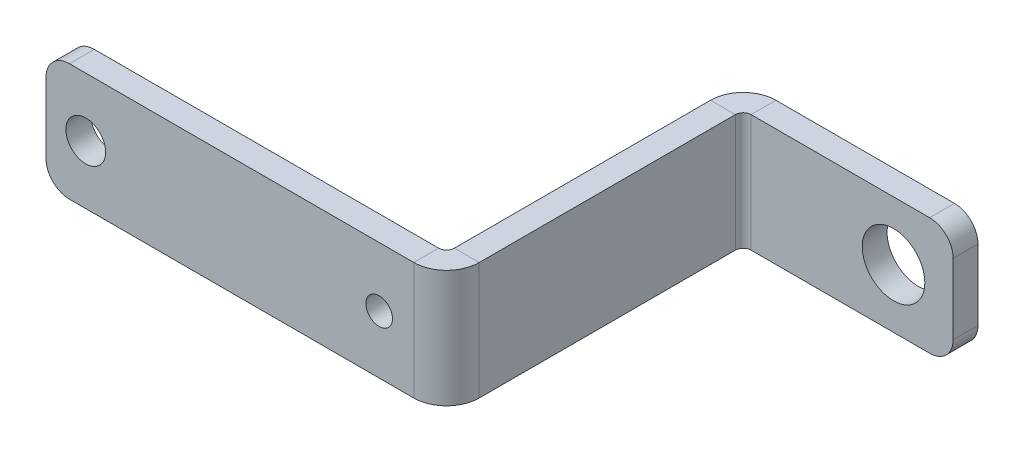
ISO-10303-21;
HEADER;
FILE_DESCRIPTION(('STEP AP214'),'2;1');
FILE_NAME('part.step','',(''),(''),'','','');
FILE_SCHEMA(('AUTOMOTIVE_DESIGN { 1 0 10303 214 1 1 1 1 }'));
ENDSEC;
DATA;
#1=APPLICATION_CONTEXT('core data for automotive mechanical design processes');
#2=APPLICATION_PROTOCOL_DEFINITION('international standard','automotive_design',2000,#1);
#3=PRODUCT_CONTEXT('',#1,'mechanical');
#4=PRODUCT('Part','Part','',(#3));
#5=PRODUCT_RELATED_PRODUCT_CATEGORY('part','',(#4));
#6=PRODUCT_DEFINITION_FORMATION('','',#4);
#7=PRODUCT_DEFINITION_CONTEXT('part definition',#1,'design');
#8=PRODUCT_DEFINITION('design','',#6,#7);
#9=PRODUCT_DEFINITION_SHAPE('','',#8);
#10=(LENGTH_UNIT() NAMED_UNIT(*) SI_UNIT(.MILLI.,.METRE.));
#11=(NAMED_UNIT(*) PLANE_ANGLE_UNIT() SI_UNIT($,.RADIAN.));
#12=(NAMED_UNIT(*) SI_UNIT($,.STERADIAN.) SOLID_ANGLE_UNIT());
#13=UNCERTAINTY_MEASURE_WITH_UNIT(LENGTH_MEASURE(1.E-05),#10,'distance_accuracy_value','');
#14=(GEOMETRIC_REPRESENTATION_CONTEXT(3) GLOBAL_UNCERTAINTY_ASSIGNED_CONTEXT((#13)) GLOBAL_UNIT_ASSIGNED_CONTEXT((#10,
#11,#12)) REPRESENTATION_CONTEXT('',''));
#15=CARTESIAN_POINT('',(0.,0.,0.));
#16=DIRECTION('',(0.,0.,1.));
#17=DIRECTION('',(1.,0.,0.));
#18=AXIS2_PLACEMENT_3D('',#15,#16,#17);
#19=CARTESIAN_POINT('',(126.00428458486,321.12805474167,-1943.33343430082));
#20=DIRECTION('',(0.,1.,0.));
#21=DIRECTION('',(0.,0.,1.));
#22=AXIS2_PLACEMENT_3D('',#19,#20,#21);
#23=PLANE('',#22);
#24=DIRECTION('',(0.,0.,-1.));
#25=VECTOR('',#24,1.);
#26=CARTESIAN_POINT('',(126.00428458486,321.12805474167,-1943.33343430082));
#27=LINE('',#26,#25);
#28=CARTESIAN_POINT('',(126.00428458486,321.12805474167,-1944.33343430082));
#29=VERTEX_POINT('',#28);
#30=CARTESIAN_POINT('',(126.004284584861,321.12805474167,-1977.07093430082));
#31=VERTEX_POINT('',#30);
#32=EDGE_CURVE('E235',#29,#31,#27,.T.);
#33=ORIENTED_EDGE('',*,*,#32,.T.);
#34=DIRECTION('',(-1.,0.,0.));
#35=VECTOR('',#34,1.);
#36=CARTESIAN_POINT('',(126.004284584861,321.12805474167,-1977.07093430082));
#37=LINE('',#36,#35);
#38=CARTESIAN_POINT('',(122.829284584861,321.12805474167,-1977.07093430082));
#39=VERTEX_POINT('',#38);
#40=EDGE_CURVE('E212',#31,#39,#37,.T.);
#41=ORIENTED_EDGE('',*,*,#40,.T.);
#42=DIRECTION('',(0.,0.,-1.));
#43=VECTOR('',#42,1.);
#44=CARTESIAN_POINT('',(122.82928458486,321.12805474167,-1943.33343430082));
#45=LINE('',#44,#43);
#46=CARTESIAN_POINT('',(122.82928458486,321.12805474167,-1944.33343430082));
#47=VERTEX_POINT('',#46);
#48=EDGE_CURVE('E234',#47,#39,#45,.T.);
#49=ORIENTED_EDGE('',*,*,#48,.F.);
#50=DIRECTION('',(1.,0.,0.));
#51=VECTOR('',#50,1.);
#52=CARTESIAN_POINT('',(122.82928458486,321.12805474167,-1944.33343430082));
#53=LINE('',#52,#51);
#54=EDGE_CURVE('E222',#47,#29,#53,.T.);
#55=ORIENTED_EDGE('',*,*,#54,.T.);
#56=EDGE_LOOP('',(#33,#41,#49,#55));
#57=FACE_BOUND('',#56,.T.);
#58=ADVANCED_FACE('F43',(#57),#23,.T.);
#59=CARTESIAN_POINT('',(126.004284584853,0.,4.52723128169523E-13));
#60=DIRECTION('',(-1.,0.,0.));
#61=DIRECTION('',(0.,0.,1.));
#62=AXIS2_PLACEMENT_3D('',#59,#60,#61);
#63=PLANE('',#62);
#64=DIRECTION('',(0.,1.,0.));
#65=VECTOR('',#64,1.);
#66=CARTESIAN_POINT('',(126.004284584861,321.12805474167,-1977.07093430082));
#67=LINE('',#66,#65);
#68=CARTESIAN_POINT('',(126.004284584861,306.12805474167,-1977.07093430082));
#69=VERTEX_POINT('',#68);
#70=EDGE_CURVE('E216',#31,#69,#67,.F.);
#71=ORIENTED_EDGE('',*,*,#70,.F.);
#72=ORIENTED_EDGE('',*,*,#32,.F.);
#73=DIRECTION('',(0.,1.,0.));
#74=VECTOR('',#73,1.);
#75=CARTESIAN_POINT('',(126.00428458486,0.,-1944.33343430082));
#76=LINE('',#75,#74);
#77=CARTESIAN_POINT('',(126.00428458486,306.12805474167,-1944.33343430082));
#78=VERTEX_POINT('',#77);
#79=EDGE_CURVE('E230',#78,#29,#76,.T.);
#80=ORIENTED_EDGE('',*,*,#79,.F.);
#81=DIRECTION('',(0.,0.,1.));
#82=VECTOR('',#81,1.);
#83=CARTESIAN_POINT('',(126.00428458486,306.12805474167,-1978.07093430082));
#84=LINE('',#83,#82);
#85=EDGE_CURVE('E238',#69,#78,#84,.T.);
#86=ORIENTED_EDGE('',*,*,#85,.F.);
#87=EDGE_LOOP('',(#71,#72,#80,#86));
#88=FACE_BOUND('',#87,.T.);
#89=ADVANCED_FACE('F349',(#88),#63,.F.);
#90=CARTESIAN_POINT('',(122.829284584853,0.,4.41637674918696E-13));
#91=DIRECTION('',(-1.,0.,0.));
#92=DIRECTION('',(0.,0.,1.));
#93=AXIS2_PLACEMENT_3D('',#90,#91,#92);
#94=PLANE('',#93);
#95=ORIENTED_EDGE('',*,*,#48,.T.);
#96=DIRECTION('',(0.,1.,0.));
#97=VECTOR('',#96,1.);
#98=CARTESIAN_POINT('',(122.829284584861,321.12805474167,-1977.07093430082));
#99=LINE('',#98,#97);
#100=CARTESIAN_POINT('',(122.82928458486,306.12805474167,-1977.07093430082));
#101=VERTEX_POINT('',#100);
#102=EDGE_CURVE('E180',#39,#101,#99,.F.);
#103=ORIENTED_EDGE('',*,*,#102,.T.);
#104=DIRECTION('',(0.,0.,1.));
#105=VECTOR('',#104,1.);
#106=CARTESIAN_POINT('',(122.82928458486,306.12805474167,-1978.07093430082));
#107=LINE('',#106,#105);
#108=CARTESIAN_POINT('',(122.82928458486,306.12805474167,-1944.33343430082));
#109=VERTEX_POINT('',#108);
#110=EDGE_CURVE('E239',#101,#109,#107,.T.);
#111=ORIENTED_EDGE('',*,*,#110,.T.);
#112=DIRECTION('',(0.,-1.,0.));
#113=VECTOR('',#112,1.);
#114=CARTESIAN_POINT('',(122.82928458486,321.12805474167,-1944.33343430082));
#115=LINE('',#114,#113);
#116=EDGE_CURVE('E224',#47,#109,#115,.T.);
#117=ORIENTED_EDGE('',*,*,#116,.F.);
#118=EDGE_LOOP('',(#95,#103,#111,#117));
#119=FACE_BOUND('',#118,.T.);
#120=ADVANCED_FACE('F356',(#119),#94,.T.);
#121=CARTESIAN_POINT('',(74.8292845848603,321.12805474167,-1940.15843430082));
#122=DIRECTION('',(0.,-1.,0.));
#123=DIRECTION('',(0.,0.,-1.));
#124=AXIS2_PLACEMENT_3D('',#121,#122,#123);
#125=PLANE('',#124);
#126=DIRECTION('',(-1.,0.,0.));
#127=VECTOR('',#126,1.);
#128=CARTESIAN_POINT('',(74.8292845848603,321.12805474167,-1943.33343430082));
#129=LINE('',#128,#127);
#130=CARTESIAN_POINT('',(121.82928458486,321.12805474167,-1943.33343430082));
#131=VERTEX_POINT('',#130);
#132=CARTESIAN_POINT('',(77.8292845848603,321.12805474167,-1943.33343430082));
#133=VERTEX_POINT('',#132);
#134=EDGE_CURVE('E265',#131,#133,#129,.T.);
#135=ORIENTED_EDGE('',*,*,#134,.T.);
#136=DIRECTION('',(0.,0.,-1.));
#137=VECTOR('',#136,1.);
#138=CARTESIAN_POINT('',(77.8292845848603,321.12805474167,-1940.15843430082));
#139=LINE('',#138,#137);
#140=CARTESIAN_POINT('',(77.8292845848603,321.12805474167,-1940.15843430082));
#141=VERTEX_POINT('',#140);
#142=EDGE_CURVE('E11',#133,#141,#139,.F.);
#143=ORIENTED_EDGE('',*,*,#142,.T.);
#144=DIRECTION('',(-1.,0.,0.));
#145=VECTOR('',#144,1.);
#146=CARTESIAN_POINT('',(74.8292845848603,321.12805474167,-1940.15843430082));
#147=LINE('',#146,#145);
#148=CARTESIAN_POINT('',(121.82928458486,321.12805474167,-1940.15843430082));
#149=VERTEX_POINT('',#148);
#150=EDGE_CURVE('E268',#149,#141,#147,.T.);
#151=ORIENTED_EDGE('',*,*,#150,.F.);
#152=DIRECTION('',(0.,0.,1.));
#153=VECTOR('',#152,1.);
#154=CARTESIAN_POINT('',(121.82928458486,321.12805474167,-1943.33343430082));
#155=LINE('',#154,#153);
#156=EDGE_CURVE('E262',#131,#149,#155,.T.);
#157=ORIENTED_EDGE('',*,*,#156,.F.);
#158=EDGE_LOOP('',(#135,#143,#151,#157));
#159=FACE_BOUND('',#158,.T.);
#160=ADVANCED_FACE('F331',(#159),#125,.F.);
#161=CARTESIAN_POINT('',(74.8292845848603,306.12805474167,-1940.15843430082));
#162=DIRECTION('',(0.,1.,0.));
#163=DIRECTION('',(0.,0.,1.));
#164=AXIS2_PLACEMENT_3D('',#161,#162,#163);
#165=PLANE('',#164);
#166=DIRECTION('',(1.,0.,0.));
#167=VECTOR('',#166,1.);
#168=CARTESIAN_POINT('',(74.8292845848603,306.12805474167,-1940.15843430082));
#169=LINE('',#168,#167);
#170=CARTESIAN_POINT('',(77.8292845848603,306.12805474167,-1940.15843430082));
#171=VERTEX_POINT('',#170);
#172=CARTESIAN_POINT('',(121.82928458486,306.12805474167,-1940.15843430082));
#173=VERTEX_POINT('',#172);
#174=EDGE_CURVE('E273',#171,#173,#169,.T.);
#175=ORIENTED_EDGE('',*,*,#174,.F.);
#176=DIRECTION('',(0.,0.,-1.));
#177=VECTOR('',#176,1.);
#178=CARTESIAN_POINT('',(77.8292845848603,306.12805474167,-1940.15843430082));
#179=LINE('',#178,#177);
#180=CARTESIAN_POINT('',(77.8292845848603,306.12805474167,-1943.33343430082));
#181=VERTEX_POINT('',#180);
#182=EDGE_CURVE('E296',#171,#181,#179,.T.);
#183=ORIENTED_EDGE('',*,*,#182,.T.);
#184=DIRECTION('',(1.,0.,0.));
#185=VECTOR('',#184,1.);
#186=CARTESIAN_POINT('',(74.8292845848603,306.12805474167,-1943.33343430082));
#187=LINE('',#186,#185);
#188=CARTESIAN_POINT('',(121.82928458486,306.12805474167,-1943.33343430082));
#189=VERTEX_POINT('',#188);
#190=EDGE_CURVE('E271',#181,#189,#187,.T.);
#191=ORIENTED_EDGE('',*,*,#190,.T.);
#192=DIRECTION('',(0.,0.,1.));
#193=VECTOR('',#192,1.);
#194=CARTESIAN_POINT('',(121.82928458486,306.12805474167,-1943.33343430082));
#195=LINE('',#194,#193);
#196=EDGE_CURVE('E252',#189,#173,#195,.T.);
#197=ORIENTED_EDGE('',*,*,#196,.T.);
#198=EDGE_LOOP('',(#175,#183,#191,#197));
#199=FACE_BOUND('',#198,.T.);
#200=ADVANCED_FACE('F317',(#199),#165,.F.);
#201=CARTESIAN_POINT('',(0.,0.,-1940.15843430082));
#202=DIRECTION('',(0.,0.,1.));
#203=DIRECTION('',(1.,0.,0.));
#204=AXIS2_PLACEMENT_3D('',#201,#202,#203);
#205=PLANE('',#204);
#206=CARTESIAN_POINT('',(117.404284584858,313.537425755326,-1940.15843430082));
#207=DIRECTION('',(0.,0.,1.));
#208=DIRECTION('',(1.,0.,0.));
#209=AXIS2_PLACEMENT_3D('',#206,#207,#208);
#210=CIRCLE('',#209,1.69999999999999);
#211=CARTESIAN_POINT('',(119.104284584858,313.537425755326,-1940.15843430082));
#212=VERTEX_POINT('',#211);
#213=EDGE_CURVE('E462',#212,#212,#210,.T.);
#214=ORIENTED_EDGE('',*,*,#213,.F.);
#215=EDGE_LOOP('',(#214));
#216=FACE_BOUND('',#215,.T.);
#217=CARTESIAN_POINT('',(79.9092845848603,313.62805474167,-1940.15843430082));
#218=DIRECTION('',(0.,0.,1.));
#219=DIRECTION('',(1.,0.,0.));
#220=AXIS2_PLACEMENT_3D('',#217,#218,#219);
#221=CIRCLE('',#220,2.54);
#222=CARTESIAN_POINT('',(82.4492845848603,313.62805474167,-1940.15843430082));
#223=VERTEX_POINT('',#222);
#224=EDGE_CURVE('E474',#223,#223,#221,.T.);
#225=ORIENTED_EDGE('',*,*,#224,.F.);
#226=EDGE_LOOP('',(#225));
#227=FACE_BOUND('',#226,.T.);
#228=DIRECTION('',(0.,-1.,0.));
#229=VECTOR('',#228,1.);
#230=CARTESIAN_POINT('',(74.8292845848603,321.12805474167,-1940.15843430082));
#231=LINE('',#230,#229);
#232=CARTESIAN_POINT('',(74.8292845848603,318.12805474167,-1940.15843430082));
#233=VERTEX_POINT('',#232);
#234=CARTESIAN_POINT('',(74.8292845848603,309.12805474167,-1940.15843430082));
#235=VERTEX_POINT('',#234);
#236=EDGE_CURVE('E270',#233,#235,#231,.T.);
#237=ORIENTED_EDGE('',*,*,#236,.T.);
#238=CARTESIAN_POINT('',(77.8292845848603,309.12805474167,-1940.15843430082));
#239=DIRECTION('',(0.,0.,1.));
#240=DIRECTION('',(1.,0.,0.));
#241=AXIS2_PLACEMENT_3D('',#238,#239,#240);
#242=CIRCLE('',#241,3.);
#243=EDGE_CURVE('E52',#235,#171,#242,.T.);
#244=ORIENTED_EDGE('',*,*,#243,.T.);
#245=ORIENTED_EDGE('',*,*,#174,.T.);
#246=DIRECTION('',(0.,-1.,0.));
#247=VECTOR('',#246,1.);
#248=CARTESIAN_POINT('',(121.82928458486,306.12805474167,-1940.15843430082));
#249=LINE('',#248,#247);
#250=EDGE_CURVE('E245',#173,#149,#249,.F.);
#251=ORIENTED_EDGE('',*,*,#250,.T.);
#252=ORIENTED_EDGE('',*,*,#150,.T.);
#253=CARTESIAN_POINT('',(77.8292845848603,318.12805474167,-1940.15843430082));
#254=DIRECTION('',(0.,0.,1.));
#255=DIRECTION('',(1.,0.,0.));
#256=AXIS2_PLACEMENT_3D('',#253,#254,#255);
#257=CIRCLE('',#256,3.);
#258=EDGE_CURVE('E307',#141,#233,#257,.T.);
#259=ORIENTED_EDGE('',*,*,#258,.T.);
#260=EDGE_LOOP('',(#237,#244,#245,#251,#252,#259));
#261=FACE_BOUND('',#260,.T.);
#262=ADVANCED_FACE('F312',(#216,#227,#261),#205,.T.);
#263=CARTESIAN_POINT('',(0.,0.,-1943.33343430082));
#264=DIRECTION('',(0.,0.,1.));
#265=DIRECTION('',(1.,0.,0.));
#266=AXIS2_PLACEMENT_3D('',#263,#264,#265);
#267=PLANE('',#266);
#268=CARTESIAN_POINT('',(117.404284584858,313.537425755326,-1943.33343430082));
#269=DIRECTION('',(0.,0.,1.));
#270=DIRECTION('',(1.,0.,0.));
#271=AXIS2_PLACEMENT_3D('',#268,#269,#270);
#272=CIRCLE('',#271,1.69999999999999);
#273=CARTESIAN_POINT('',(119.104284584858,313.537425755326,-1943.33343430082));
#274=VERTEX_POINT('',#273);
#275=EDGE_CURVE('E465',#274,#274,#272,.T.);
#276=ORIENTED_EDGE('',*,*,#275,.T.);
#277=EDGE_LOOP('',(#276));
#278=FACE_BOUND('',#277,.T.);
#279=CARTESIAN_POINT('',(79.9092845848603,313.62805474167,-1943.33343430082));
#280=DIRECTION('',(0.,0.,1.));
#281=DIRECTION('',(1.,0.,0.));
#282=AXIS2_PLACEMENT_3D('',#279,#280,#281);
#283=CIRCLE('',#282,2.54);
#284=CARTESIAN_POINT('',(82.4492845848603,313.62805474167,-1943.33343430082));
#285=VERTEX_POINT('',#284);
#286=EDGE_CURVE('E47',#285,#285,#283,.T.);
#287=ORIENTED_EDGE('',*,*,#286,.T.);
#288=EDGE_LOOP('',(#287));
#289=FACE_BOUND('',#288,.T.);
#290=ORIENTED_EDGE('',*,*,#190,.F.);
#291=CARTESIAN_POINT('',(77.8292845848603,309.12805474167,-1943.33343430082));
#292=DIRECTION('',(0.,0.,1.));
#293=DIRECTION('',(1.,0.,0.));
#294=AXIS2_PLACEMENT_3D('',#291,#292,#293);
#295=CIRCLE('',#294,3.);
#296=CARTESIAN_POINT('',(74.8292845848603,309.12805474167,-1943.33343430082));
#297=VERTEX_POINT('',#296);
#298=EDGE_CURVE('E301',#181,#297,#295,.F.);
#299=ORIENTED_EDGE('',*,*,#298,.T.);
#300=DIRECTION('',(0.,-1.,0.));
#301=VECTOR('',#300,1.);
#302=CARTESIAN_POINT('',(74.8292845848603,321.12805474167,-1943.33343430082));
#303=LINE('',#302,#301);
#304=CARTESIAN_POINT('',(74.8292845848603,318.12805474167,-1943.33343430082));
#305=VERTEX_POINT('',#304);
#306=EDGE_CURVE('E277',#305,#297,#303,.T.);
#307=ORIENTED_EDGE('',*,*,#306,.F.);
#308=CARTESIAN_POINT('',(77.8292845848603,318.12805474167,-1943.33343430082));
#309=DIRECTION('',(0.,0.,1.));
#310=DIRECTION('',(1.,0.,0.));
#311=AXIS2_PLACEMENT_3D('',#308,#309,#310);
#312=CIRCLE('',#311,3.);
#313=EDGE_CURVE('E299',#305,#133,#312,.F.);
#314=ORIENTED_EDGE('',*,*,#313,.T.);
#315=ORIENTED_EDGE('',*,*,#134,.F.);
#316=DIRECTION('',(0.,-1.,0.));
#317=VECTOR('',#316,1.);
#318=CARTESIAN_POINT('',(121.82928458486,306.12805474167,-1943.33343430082));
#319=LINE('',#318,#317);
#320=EDGE_CURVE('E258',#189,#131,#319,.F.);
#321=ORIENTED_EDGE('',*,*,#320,.F.);
#322=EDGE_LOOP('',(#290,#299,#307,#314,#315,#321));
#323=FACE_BOUND('',#322,.T.);
#324=ADVANCED_FACE('F323',(#278,#289,#323),#267,.F.);
#325=CARTESIAN_POINT('',(74.8292845848603,321.12805474167,-1940.15843430082));
#326=DIRECTION('',(1.,0.,0.));
#327=DIRECTION('',(0.,0.,-1.));
#328=AXIS2_PLACEMENT_3D('',#325,#326,#327);
#329=PLANE('',#328);
#330=ORIENTED_EDGE('',*,*,#306,.T.);
#331=DIRECTION('',(0.,0.,-1.));
#332=VECTOR('',#331,1.);
#333=CARTESIAN_POINT('',(74.8292845848603,309.12805474167,-1940.15843430082));
#334=LINE('',#333,#332);
#335=EDGE_CURVE('E65',#297,#235,#334,.F.);
#336=ORIENTED_EDGE('',*,*,#335,.T.);
#337=ORIENTED_EDGE('',*,*,#236,.F.);
#338=DIRECTION('',(0.,0.,-1.));
#339=VECTOR('',#338,1.);
#340=CARTESIAN_POINT('',(74.8292845848603,318.12805474167,-1940.15843430082));
#341=LINE('',#340,#339);
#342=EDGE_CURVE('E303',#233,#305,#341,.T.);
#343=ORIENTED_EDGE('',*,*,#342,.T.);
#344=EDGE_LOOP('',(#330,#336,#337,#343));
#345=FACE_BOUND('',#344,.T.);
#346=ADVANCED_FACE('F325',(#345),#329,.F.);
#347=CARTESIAN_POINT('',(121.82928458486,321.12805474167,-1944.33343430082));
#348=DIRECTION('',(0.,1.,0.));
#349=DIRECTION('',(0.,0.,1.));
#350=AXIS2_PLACEMENT_3D('',#347,#348,#349);
#351=PLANE('',#350);
#352=ORIENTED_EDGE('',*,*,#54,.F.);
#353=CARTESIAN_POINT('',(121.82928458486,321.12805474167,-1944.33343430082));
#354=DIRECTION('',(0.,-1.,0.));
#355=DIRECTION('',(0.,0.,-1.));
#356=AXIS2_PLACEMENT_3D('',#353,#354,#355);
#357=CIRCLE('',#356,0.999999999999959);
#358=EDGE_CURVE('E255',#131,#47,#357,.F.);
#359=ORIENTED_EDGE('',*,*,#358,.F.);
#360=ORIENTED_EDGE('',*,*,#156,.T.);
#361=CARTESIAN_POINT('',(121.82928458486,321.12805474167,-1944.33343430082));
#362=DIRECTION('',(0.,-1.,0.));
#363=DIRECTION('',(0.,0.,-1.));
#364=AXIS2_PLACEMENT_3D('',#361,#362,#363);
#365=CIRCLE('',#364,4.17499999999996);
#366=EDGE_CURVE('E248',#149,#29,#365,.F.);
#367=ORIENTED_EDGE('',*,*,#366,.T.);
#368=EDGE_LOOP('',(#352,#359,#360,#367));
#369=FACE_BOUND('',#368,.T.);
#370=ADVANCED_FACE('F334',(#369),#351,.T.);
#371=CARTESIAN_POINT('',(121.82928458486,306.12805474167,-1944.33343430082));
#372=DIRECTION('',(0.,1.,0.));
#373=DIRECTION('',(0.,0.,1.));
#374=AXIS2_PLACEMENT_3D('',#371,#372,#373);
#375=PLANE('',#374);
#376=CARTESIAN_POINT('',(121.82928458486,306.12805474167,-1944.33343430082));
#377=DIRECTION('',(0.,-1.,0.));
#378=DIRECTION('',(0.,0.,-1.));
#379=AXIS2_PLACEMENT_3D('',#376,#377,#378);
#380=CIRCLE('',#379,0.999999999999959);
#381=EDGE_CURVE('E241',#109,#189,#380,.T.);
#382=ORIENTED_EDGE('',*,*,#381,.F.);
#383=DIRECTION('',(1.,0.,0.));
#384=VECTOR('',#383,1.);
#385=CARTESIAN_POINT('',(122.82928458486,306.12805474167,-1944.33343430082));
#386=LINE('',#385,#384);
#387=EDGE_CURVE('E227',#109,#78,#386,.T.);
#388=ORIENTED_EDGE('',*,*,#387,.T.);
#389=CARTESIAN_POINT('',(121.82928458486,306.12805474167,-1944.33343430082));
#390=DIRECTION('',(0.,-1.,0.));
#391=DIRECTION('',(0.,0.,-1.));
#392=AXIS2_PLACEMENT_3D('',#389,#390,#391);
#393=CIRCLE('',#392,4.17499999999996);
#394=EDGE_CURVE('E249',#78,#173,#393,.T.);
#395=ORIENTED_EDGE('',*,*,#394,.T.);
#396=ORIENTED_EDGE('',*,*,#196,.F.);
#397=EDGE_LOOP('',(#382,#388,#395,#396));
#398=FACE_BOUND('',#397,.T.);
#399=ADVANCED_FACE('F340',(#398),#375,.F.);
#400=CARTESIAN_POINT('',(121.82928458486,306.12805474167,-1944.33343430082));
#401=DIRECTION('',(0.,-1.,0.));
#402=DIRECTION('',(1.,0.,0.));
#403=AXIS2_PLACEMENT_3D('',#400,#401,#402);
#404=CYLINDRICAL_SURFACE('',#403,4.17499999999996);
#405=ORIENTED_EDGE('',*,*,#250,.F.);
#406=ORIENTED_EDGE('',*,*,#394,.F.);
#407=ORIENTED_EDGE('',*,*,#79,.T.);
#408=ORIENTED_EDGE('',*,*,#366,.F.);
#409=EDGE_LOOP('',(#405,#406,#407,#408));
#410=FACE_BOUND('',#409,.T.);
#411=ADVANCED_FACE('F337',(#410),#404,.T.);
#412=CARTESIAN_POINT('',(121.82928458486,306.12805474167,-1944.33343430082));
#413=DIRECTION('',(0.,-1.,0.));
#414=DIRECTION('',(1.,0.,0.));
#415=AXIS2_PLACEMENT_3D('',#412,#413,#414);
#416=CYLINDRICAL_SURFACE('',#415,0.999999999999959);
#417=ORIENTED_EDGE('',*,*,#320,.T.);
#418=ORIENTED_EDGE('',*,*,#358,.T.);
#419=ORIENTED_EDGE('',*,*,#116,.T.);
#420=ORIENTED_EDGE('',*,*,#381,.T.);
#421=EDGE_LOOP('',(#417,#418,#419,#420));
#422=FACE_BOUND('',#421,.T.);
#423=ADVANCED_FACE('F354',(#422),#416,.F.);
#424=CARTESIAN_POINT('',(126.00428458486,306.12805474167,-1978.07093430082));
#425=DIRECTION('',(0.,-1.,0.));
#426=DIRECTION('',(0.,0.,-1.));
#427=AXIS2_PLACEMENT_3D('',#424,#425,#426);
#428=PLANE('',#427);
#429=DIRECTION('',(-1.,0.,0.));
#430=VECTOR('',#429,1.);
#431=CARTESIAN_POINT('',(126.004284584861,306.12805474167,-1977.07093430082));
#432=LINE('',#431,#430);
#433=EDGE_CURVE('E219',#69,#101,#432,.T.);
#434=ORIENTED_EDGE('',*,*,#433,.F.);
#435=ORIENTED_EDGE('',*,*,#85,.T.);
#436=ORIENTED_EDGE('',*,*,#387,.F.);
#437=ORIENTED_EDGE('',*,*,#110,.F.);
#438=EDGE_LOOP('',(#434,#435,#436,#437));
#439=FACE_BOUND('',#438,.T.);
#440=ADVANCED_FACE('F358',(#439),#428,.T.);
#441=CARTESIAN_POINT('',(127.00428458486,306.12805474167,-1977.07093430082));
#442=DIRECTION('',(0.,-1.,0.));
#443=DIRECTION('',(0.,0.,-1.));
#444=AXIS2_PLACEMENT_3D('',#441,#442,#443);
#445=PLANE('',#444);
#446=DIRECTION('',(0.,0.,-1.));
#447=VECTOR('',#446,1.);
#448=CARTESIAN_POINT('',(127.00428458486,306.12805474167,-1978.07093430082));
#449=LINE('',#448,#447);
#450=CARTESIAN_POINT('',(127.00428458486,306.12805474167,-1978.07093430082));
#451=VERTEX_POINT('',#450);
#452=CARTESIAN_POINT('',(127.00428458486,306.12805474167,-1981.24593430082));
#453=VERTEX_POINT('',#452);
#454=EDGE_CURVE('E202',#451,#453,#449,.T.);
#455=ORIENTED_EDGE('',*,*,#454,.F.);
#456=CARTESIAN_POINT('',(127.00428458486,306.12805474167,-1977.07093430082));
#457=DIRECTION('',(0.,1.,0.));
#458=DIRECTION('',(0.,0.,1.));
#459=AXIS2_PLACEMENT_3D('',#456,#457,#458);
#460=CIRCLE('',#459,0.99999999999989);
#461=EDGE_CURVE('E183',#69,#451,#460,.F.);
#462=ORIENTED_EDGE('',*,*,#461,.F.);
#463=ORIENTED_EDGE('',*,*,#433,.T.);
#464=CARTESIAN_POINT('',(127.00428458486,306.12805474167,-1977.07093430082));
#465=DIRECTION('',(0.,1.,0.));
#466=DIRECTION('',(0.,0.,1.));
#467=AXIS2_PLACEMENT_3D('',#464,#465,#466);
#468=CIRCLE('',#467,4.17499999999989);
#469=EDGE_CURVE('E211',#101,#453,#468,.F.);
#470=ORIENTED_EDGE('',*,*,#469,.T.);
#471=EDGE_LOOP('',(#455,#462,#463,#470));
#472=FACE_BOUND('',#471,.T.);
#473=ADVANCED_FACE('F361',(#472),#445,.T.);
#474=CARTESIAN_POINT('',(127.00428458486,321.12805474167,-1977.07093430082));
#475=DIRECTION('',(0.,-1.,0.));
#476=DIRECTION('',(0.,0.,-1.));
#477=AXIS2_PLACEMENT_3D('',#474,#475,#476);
#478=PLANE('',#477);
#479=CARTESIAN_POINT('',(127.00428458486,321.12805474167,-1977.07093430082));
#480=DIRECTION('',(0.,1.,0.));
#481=DIRECTION('',(0.,0.,1.));
#482=AXIS2_PLACEMENT_3D('',#479,#480,#481);
#483=CIRCLE('',#482,0.99999999999989);
#484=CARTESIAN_POINT('',(127.00428458486,321.12805474167,-1978.07093430082));
#485=VERTEX_POINT('',#484);
#486=EDGE_CURVE('E170',#485,#31,#483,.T.);
#487=ORIENTED_EDGE('',*,*,#486,.F.);
#488=DIRECTION('',(0.,0.,-1.));
#489=VECTOR('',#488,1.);
#490=CARTESIAN_POINT('',(127.00428458486,321.12805474167,-1978.07093430082));
#491=LINE('',#490,#489);
#492=CARTESIAN_POINT('',(127.00428458486,321.12805474167,-1981.24593430082));
#493=VERTEX_POINT('',#492);
#494=EDGE_CURVE('E164',#485,#493,#491,.T.);
#495=ORIENTED_EDGE('',*,*,#494,.T.);
#496=CARTESIAN_POINT('',(127.00428458486,321.12805474167,-1977.07093430082));
#497=DIRECTION('',(0.,1.,0.));
#498=DIRECTION('',(0.,0.,1.));
#499=AXIS2_PLACEMENT_3D('',#496,#497,#498);
#500=CIRCLE('',#499,4.17499999999989);
#501=EDGE_CURVE('E175',#493,#39,#500,.T.);
#502=ORIENTED_EDGE('',*,*,#501,.T.);
#503=ORIENTED_EDGE('',*,*,#40,.F.);
#504=EDGE_LOOP('',(#487,#495,#502,#503));
#505=FACE_BOUND('',#504,.T.);
#506=ADVANCED_FACE('F186',(#505),#478,.F.);
#507=CARTESIAN_POINT('',(127.00428458486,321.12805474167,-1977.07093430082));
#508=DIRECTION('',(0.,1.,0.));
#509=DIRECTION('',(0.,0.,-1.));
#510=AXIS2_PLACEMENT_3D('',#507,#508,#509);
#511=CYLINDRICAL_SURFACE('',#510,4.17499999999989);
#512=ORIENTED_EDGE('',*,*,#102,.F.);
#513=ORIENTED_EDGE('',*,*,#501,.F.);
#514=DIRECTION('',(0.,-1.,0.));
#515=VECTOR('',#514,1.);
#516=CARTESIAN_POINT('',(127.00428458486,0.,-1981.24593430082));
#517=LINE('',#516,#515);
#518=EDGE_CURVE('E177',#493,#453,#517,.T.);
#519=ORIENTED_EDGE('',*,*,#518,.T.);
#520=ORIENTED_EDGE('',*,*,#469,.F.);
#521=EDGE_LOOP('',(#512,#513,#519,#520));
#522=FACE_BOUND('',#521,.T.);
#523=ADVANCED_FACE('F176',(#522),#511,.T.);
#524=CARTESIAN_POINT('',(127.00428458486,321.12805474167,-1977.07093430082));
#525=DIRECTION('',(0.,1.,0.));
#526=DIRECTION('',(0.,0.,-1.));
#527=AXIS2_PLACEMENT_3D('',#524,#525,#526);
#528=CYLINDRICAL_SURFACE('',#527,0.99999999999989);
#529=ORIENTED_EDGE('',*,*,#70,.T.);
#530=ORIENTED_EDGE('',*,*,#461,.T.);
#531=DIRECTION('',(0.,1.,0.));
#532=VECTOR('',#531,1.);
#533=CARTESIAN_POINT('',(127.00428458486,306.12805474167,-1978.07093430082));
#534=LINE('',#533,#532);
#535=EDGE_CURVE('E188',#451,#485,#534,.T.);
#536=ORIENTED_EDGE('',*,*,#535,.T.);
#537=ORIENTED_EDGE('',*,*,#486,.T.);
#538=EDGE_LOOP('',(#529,#530,#536,#537));
#539=FACE_BOUND('',#538,.T.);
#540=ADVANCED_FACE('F366',(#539),#528,.F.);
#541=CARTESIAN_POINT('',(126.00428458486,306.12805474167,-1981.24593430082));
#542=DIRECTION('',(0.,-1.,0.));
#543=DIRECTION('',(0.,0.,-1.));
#544=AXIS2_PLACEMENT_3D('',#541,#542,#543);
#545=PLANE('',#544);
#546=DIRECTION('',(1.,0.,0.));
#547=VECTOR('',#546,1.);
#548=CARTESIAN_POINT('',(126.00428458486,306.12805474167,-1981.24593430082));
#549=LINE('',#548,#547);
#550=CARTESIAN_POINT('',(149.82928458486,306.12805474167,-1981.24593430082));
#551=VERTEX_POINT('',#550);
#552=EDGE_CURVE('E194',#453,#551,#549,.T.);
#553=ORIENTED_EDGE('',*,*,#552,.T.);
#554=DIRECTION('',(0.,0.,1.));
#555=VECTOR('',#554,1.);
#556=CARTESIAN_POINT('',(149.82928458486,306.12805474167,-1981.24593430082));
#557=LINE('',#556,#555);
#558=CARTESIAN_POINT('',(149.82928458486,306.12805474167,-1978.07093430082));
#559=VERTEX_POINT('',#558);
#560=EDGE_CURVE('E275',#551,#559,#557,.T.);
#561=ORIENTED_EDGE('',*,*,#560,.T.);
#562=DIRECTION('',(1.,0.,0.));
#563=VECTOR('',#562,1.);
#564=CARTESIAN_POINT('',(126.00428458486,306.12805474167,-1978.07093430082));
#565=LINE('',#564,#563);
#566=EDGE_CURVE('E195',#451,#559,#565,.T.);
#567=ORIENTED_EDGE('',*,*,#566,.F.);
#568=ORIENTED_EDGE('',*,*,#454,.T.);
#569=EDGE_LOOP('',(#553,#561,#567,#568));
#570=FACE_BOUND('',#569,.T.);
#571=ADVANCED_FACE('F372',(#570),#545,.T.);
#572=CARTESIAN_POINT('',(152.82928458486,321.12805474167,-1981.24593430082));
#573=DIRECTION('',(0.,1.,0.));
#574=DIRECTION('',(0.,0.,1.));
#575=AXIS2_PLACEMENT_3D('',#572,#573,#574);
#576=PLANE('',#575);
#577=DIRECTION('',(-1.,0.,0.));
#578=VECTOR('',#577,1.);
#579=CARTESIAN_POINT('',(152.82928458486,321.12805474167,-1978.07093430082));
#580=LINE('',#579,#578);
#581=CARTESIAN_POINT('',(149.82928458486,321.12805474167,-1978.07093430082));
#582=VERTEX_POINT('',#581);
#583=EDGE_CURVE('E204',#582,#485,#580,.T.);
#584=ORIENTED_EDGE('',*,*,#583,.F.);
#585=DIRECTION('',(0.,0.,1.));
#586=VECTOR('',#585,1.);
#587=CARTESIAN_POINT('',(149.82928458486,321.12805474167,-1981.24593430082));
#588=LINE('',#587,#586);
#589=CARTESIAN_POINT('',(149.82928458486,321.12805474167,-1981.24593430082));
#590=VERTEX_POINT('',#589);
#591=EDGE_CURVE('E166',#582,#590,#588,.F.);
#592=ORIENTED_EDGE('',*,*,#591,.T.);
#593=DIRECTION('',(-1.,0.,0.));
#594=VECTOR('',#593,1.);
#595=CARTESIAN_POINT('',(152.82928458486,321.12805474167,-1981.24593430082));
#596=LINE('',#595,#594);
#597=EDGE_CURVE('E159',#590,#493,#596,.T.);
#598=ORIENTED_EDGE('',*,*,#597,.T.);
#599=ORIENTED_EDGE('',*,*,#494,.F.);
#600=EDGE_LOOP('',(#584,#592,#598,#599));
#601=FACE_BOUND('',#600,.T.);
#602=ADVANCED_FACE('F162',(#601),#576,.T.);
#603=CARTESIAN_POINT('',(0.,0.,-1981.24593430082));
#604=DIRECTION('',(0.,0.,1.));
#605=DIRECTION('',(1.,0.,0.));
#606=AXIS2_PLACEMENT_3D('',#603,#604,#605);
#607=PLANE('',#606);
#608=CARTESIAN_POINT('',(145.20928458486,313.62805474167,-1981.24593430082));
#609=DIRECTION('',(0.,0.,1.));
#610=DIRECTION('',(1.,0.,0.));
#611=AXIS2_PLACEMENT_3D('',#608,#609,#610);
#612=CIRCLE('',#611,3.99999999999999);
#613=CARTESIAN_POINT('',(149.20928458486,313.62805474167,-1981.24593430082));
#614=VERTEX_POINT('',#613);
#615=EDGE_CURVE('E469',#614,#614,#612,.T.);
#616=ORIENTED_EDGE('',*,*,#615,.T.);
#617=EDGE_LOOP('',(#616));
#618=FACE_BOUND('',#617,.T.);
#619=DIRECTION('',(0.,1.,0.));
#620=VECTOR('',#619,1.);
#621=CARTESIAN_POINT('',(152.82928458486,306.12805474167,-1981.24593430082));
#622=LINE('',#621,#620);
#623=CARTESIAN_POINT('',(152.82928458486,309.12805474167,-1981.24593430082));
#624=VERTEX_POINT('',#623);
#625=CARTESIAN_POINT('',(152.82928458486,318.12805474167,-1981.24593430082));
#626=VERTEX_POINT('',#625);
#627=EDGE_CURVE('E171',#624,#626,#622,.T.);
#628=ORIENTED_EDGE('',*,*,#627,.F.);
#629=CARTESIAN_POINT('',(149.82928458486,309.12805474167,-1981.24593430082));
#630=DIRECTION('',(0.,0.,1.));
#631=DIRECTION('',(1.,0.,0.));
#632=AXIS2_PLACEMENT_3D('',#629,#630,#631);
#633=CIRCLE('',#632,3.);
#634=EDGE_CURVE('E293',#624,#551,#633,.F.);
#635=ORIENTED_EDGE('',*,*,#634,.T.);
#636=ORIENTED_EDGE('',*,*,#552,.F.);
#637=ORIENTED_EDGE('',*,*,#518,.F.);
#638=ORIENTED_EDGE('',*,*,#597,.F.);
#639=CARTESIAN_POINT('',(149.82928458486,318.12805474167,-1981.24593430082));
#640=DIRECTION('',(0.,0.,1.));
#641=DIRECTION('',(1.,0.,0.));
#642=AXIS2_PLACEMENT_3D('',#639,#640,#641);
#643=CIRCLE('',#642,3.);
#644=EDGE_CURVE('E291',#590,#626,#643,.F.);
#645=ORIENTED_EDGE('',*,*,#644,.T.);
#646=EDGE_LOOP('',(#628,#635,#636,#637,#638,#645));
#647=FACE_BOUND('',#646,.T.);
#648=ADVANCED_FACE('F192',(#618,#647),#607,.F.);
#649=CARTESIAN_POINT('',(0.,0.,-1978.07093430082));
#650=DIRECTION('',(0.,0.,1.));
#651=DIRECTION('',(1.,0.,0.));
#652=AXIS2_PLACEMENT_3D('',#649,#650,#651);
#653=PLANE('',#652);
#654=CARTESIAN_POINT('',(145.20928458486,313.62805474167,-1978.07093430082));
#655=DIRECTION('',(0.,0.,1.));
#656=DIRECTION('',(1.,0.,0.));
#657=AXIS2_PLACEMENT_3D('',#654,#655,#656);
#658=CIRCLE('',#657,3.99999999999999);
#659=CARTESIAN_POINT('',(149.20928458486,313.62805474167,-1978.07093430082));
#660=VERTEX_POINT('',#659);
#661=EDGE_CURVE('E466',#660,#660,#658,.T.);
#662=ORIENTED_EDGE('',*,*,#661,.F.);
#663=EDGE_LOOP('',(#662));
#664=FACE_BOUND('',#663,.T.);
#665=ORIENTED_EDGE('',*,*,#566,.T.);
#666=CARTESIAN_POINT('',(149.82928458486,309.12805474167,-1978.07093430082));
#667=DIRECTION('',(0.,0.,1.));
#668=DIRECTION('',(1.,0.,0.));
#669=AXIS2_PLACEMENT_3D('',#666,#667,#668);
#670=CIRCLE('',#669,3.);
#671=CARTESIAN_POINT('',(152.82928458486,309.12805474167,-1978.07093430082));
#672=VERTEX_POINT('',#671);
#673=EDGE_CURVE('E284',#559,#672,#670,.T.);
#674=ORIENTED_EDGE('',*,*,#673,.T.);
#675=DIRECTION('',(0.,1.,0.));
#676=VECTOR('',#675,1.);
#677=CARTESIAN_POINT('',(152.82928458486,306.12805474167,-1978.07093430082));
#678=LINE('',#677,#676);
#679=CARTESIAN_POINT('',(152.82928458486,318.12805474167,-1978.07093430082));
#680=VERTEX_POINT('',#679);
#681=EDGE_CURVE('E198',#672,#680,#678,.T.);
#682=ORIENTED_EDGE('',*,*,#681,.T.);
#683=CARTESIAN_POINT('',(149.82928458486,318.12805474167,-1978.07093430082));
#684=DIRECTION('',(0.,0.,1.));
#685=DIRECTION('',(1.,0.,0.));
#686=AXIS2_PLACEMENT_3D('',#683,#684,#685);
#687=CIRCLE('',#686,3.);
#688=EDGE_CURVE('E282',#680,#582,#687,.T.);
#689=ORIENTED_EDGE('',*,*,#688,.T.);
#690=ORIENTED_EDGE('',*,*,#583,.T.);
#691=ORIENTED_EDGE('',*,*,#535,.F.);
#692=EDGE_LOOP('',(#665,#674,#682,#689,#690,#691));
#693=FACE_BOUND('',#692,.T.);
#694=ADVANCED_FACE('F369',(#664,#693),#653,.T.);
#695=CARTESIAN_POINT('',(152.82928458486,306.12805474167,-1981.24593430082));
#696=DIRECTION('',(1.,0.,0.));
#697=DIRECTION('',(0.,0.,-1.));
#698=AXIS2_PLACEMENT_3D('',#695,#696,#697);
#699=PLANE('',#698);
#700=ORIENTED_EDGE('',*,*,#681,.F.);
#701=DIRECTION('',(0.,0.,1.));
#702=VECTOR('',#701,1.);
#703=CARTESIAN_POINT('',(152.82928458486,309.12805474167,-1981.24593430082));
#704=LINE('',#703,#702);
#705=EDGE_CURVE('E289',#672,#624,#704,.F.);
#706=ORIENTED_EDGE('',*,*,#705,.T.);
#707=ORIENTED_EDGE('',*,*,#627,.T.);
#708=DIRECTION('',(0.,0.,1.));
#709=VECTOR('',#708,1.);
#710=CARTESIAN_POINT('',(152.82928458486,318.12805474167,-1981.24593430082));
#711=LINE('',#710,#709);
#712=EDGE_CURVE('E286',#626,#680,#711,.T.);
#713=ORIENTED_EDGE('',*,*,#712,.T.);
#714=EDGE_LOOP('',(#700,#706,#707,#713));
#715=FACE_BOUND('',#714,.T.);
#716=ADVANCED_FACE('F380',(#715),#699,.T.);
#717=CARTESIAN_POINT('',(149.82928458486,309.12805474167,-1981.24593430082));
#718=DIRECTION('',(0.,0.,1.));
#719=DIRECTION('',(1.,0.,0.));
#720=AXIS2_PLACEMENT_3D('',#717,#718,#719);
#721=CYLINDRICAL_SURFACE('',#720,3.);
#722=ORIENTED_EDGE('',*,*,#634,.F.);
#723=ORIENTED_EDGE('',*,*,#705,.F.);
#724=ORIENTED_EDGE('',*,*,#673,.F.);
#725=ORIENTED_EDGE('',*,*,#560,.F.);
#726=EDGE_LOOP('',(#722,#723,#724,#725));
#727=FACE_BOUND('',#726,.T.);
#728=ADVANCED_FACE('F376',(#727),#721,.T.);
#729=CARTESIAN_POINT('',(149.82928458486,318.12805474167,-1981.24593430082));
#730=DIRECTION('',(0.,0.,1.));
#731=DIRECTION('',(1.,0.,0.));
#732=AXIS2_PLACEMENT_3D('',#729,#730,#731);
#733=CYLINDRICAL_SURFACE('',#732,3.);
#734=ORIENTED_EDGE('',*,*,#644,.F.);
#735=ORIENTED_EDGE('',*,*,#591,.F.);
#736=ORIENTED_EDGE('',*,*,#688,.F.);
#737=ORIENTED_EDGE('',*,*,#712,.F.);
#738=EDGE_LOOP('',(#734,#735,#736,#737));
#739=FACE_BOUND('',#738,.T.);
#740=ADVANCED_FACE('F383',(#739),#733,.T.);
#741=CARTESIAN_POINT('',(77.8292845848603,309.12805474167,-1940.15843430082));
#742=DIRECTION('',(0.,0.,-1.));
#743=DIRECTION('',(-1.,0.,0.));
#744=AXIS2_PLACEMENT_3D('',#741,#742,#743);
#745=CYLINDRICAL_SURFACE('',#744,3.);
#746=ORIENTED_EDGE('',*,*,#243,.F.);
#747=ORIENTED_EDGE('',*,*,#335,.F.);
#748=ORIENTED_EDGE('',*,*,#298,.F.);
#749=ORIENTED_EDGE('',*,*,#182,.F.);
#750=EDGE_LOOP('',(#746,#747,#748,#749));
#751=FACE_BOUND('',#750,.T.);
#752=ADVANCED_FACE('F320',(#751),#745,.T.);
#753=CARTESIAN_POINT('',(77.8292845848603,318.12805474167,-1940.15843430082));
#754=DIRECTION('',(0.,0.,-1.));
#755=DIRECTION('',(-1.,0.,0.));
#756=AXIS2_PLACEMENT_3D('',#753,#754,#755);
#757=CYLINDRICAL_SURFACE('',#756,3.);
#758=ORIENTED_EDGE('',*,*,#258,.F.);
#759=ORIENTED_EDGE('',*,*,#142,.F.);
#760=ORIENTED_EDGE('',*,*,#313,.F.);
#761=ORIENTED_EDGE('',*,*,#342,.F.);
#762=EDGE_LOOP('',(#758,#759,#760,#761));
#763=FACE_BOUND('',#762,.T.);
#764=ADVANCED_FACE('F45',(#763),#757,.T.);
#765=CARTESIAN_POINT('',(79.9092845848603,313.62805474167,-1981.24593430082));
#766=DIRECTION('',(0.,0.,1.));
#767=DIRECTION('',(1.,0.,0.));
#768=AXIS2_PLACEMENT_3D('',#765,#766,#767);
#769=CYLINDRICAL_SURFACE('',#768,2.54);
#770=ORIENTED_EDGE('',*,*,#224,.T.);
#771=EDGE_LOOP('',(#770));
#772=FACE_BOUND('',#771,.T.);
#773=ORIENTED_EDGE('',*,*,#286,.F.);
#774=EDGE_LOOP('',(#773));
#775=FACE_BOUND('',#774,.T.);
#776=ADVANCED_FACE('F446',(#772,#775),#769,.F.);
#777=CARTESIAN_POINT('',(145.20928458486,313.62805474167,-1981.24593430082));
#778=DIRECTION('',(0.,0.,1.));
#779=DIRECTION('',(1.,0.,0.));
#780=AXIS2_PLACEMENT_3D('',#777,#778,#779);
#781=CYLINDRICAL_SURFACE('',#780,3.99999999999999);
#782=ORIENTED_EDGE('',*,*,#615,.F.);
#783=EDGE_LOOP('',(#782));
#784=FACE_BOUND('',#783,.T.);
#785=ORIENTED_EDGE('',*,*,#661,.T.);
#786=EDGE_LOOP('',(#785));
#787=FACE_BOUND('',#786,.T.);
#788=ADVANCED_FACE('F449',(#784,#787),#781,.F.);
#789=CARTESIAN_POINT('',(117.404284584858,313.537425755326,-1940.15843430082));
#790=DIRECTION('',(0.,0.,1.));
#791=DIRECTION('',(1.,0.,0.));
#792=AXIS2_PLACEMENT_3D('',#789,#790,#791);
#793=CYLINDRICAL_SURFACE('',#792,1.69999999999999);
#794=ORIENTED_EDGE('',*,*,#213,.T.);
#795=EDGE_LOOP('',(#794));
#796=FACE_BOUND('',#795,.T.);
#797=ORIENTED_EDGE('',*,*,#275,.F.);
#798=EDGE_LOOP('',(#797));
#799=FACE_BOUND('',#798,.T.);
#800=ADVANCED_FACE('F453',(#796,#799),#793,.F.);
#801=CLOSED_SHELL('',(#58,#89,#120,#160,#200,#262,#324,#346,#370,#399,#411,#423,#440,#473,#506,
#523,#540,#571,#602,#648,#694,#716,#728,#740,#752,#764,#776,#788,#800));
#802=MANIFOLD_SOLID_BREP('B2',#801);
#803=ADVANCED_BREP_SHAPE_REPRESENTATION('',(#18,#802),#14);
#804=SHAPE_DEFINITION_REPRESENTATION(#9,#803);
ENDSEC;
END-ISO-10303-21;
